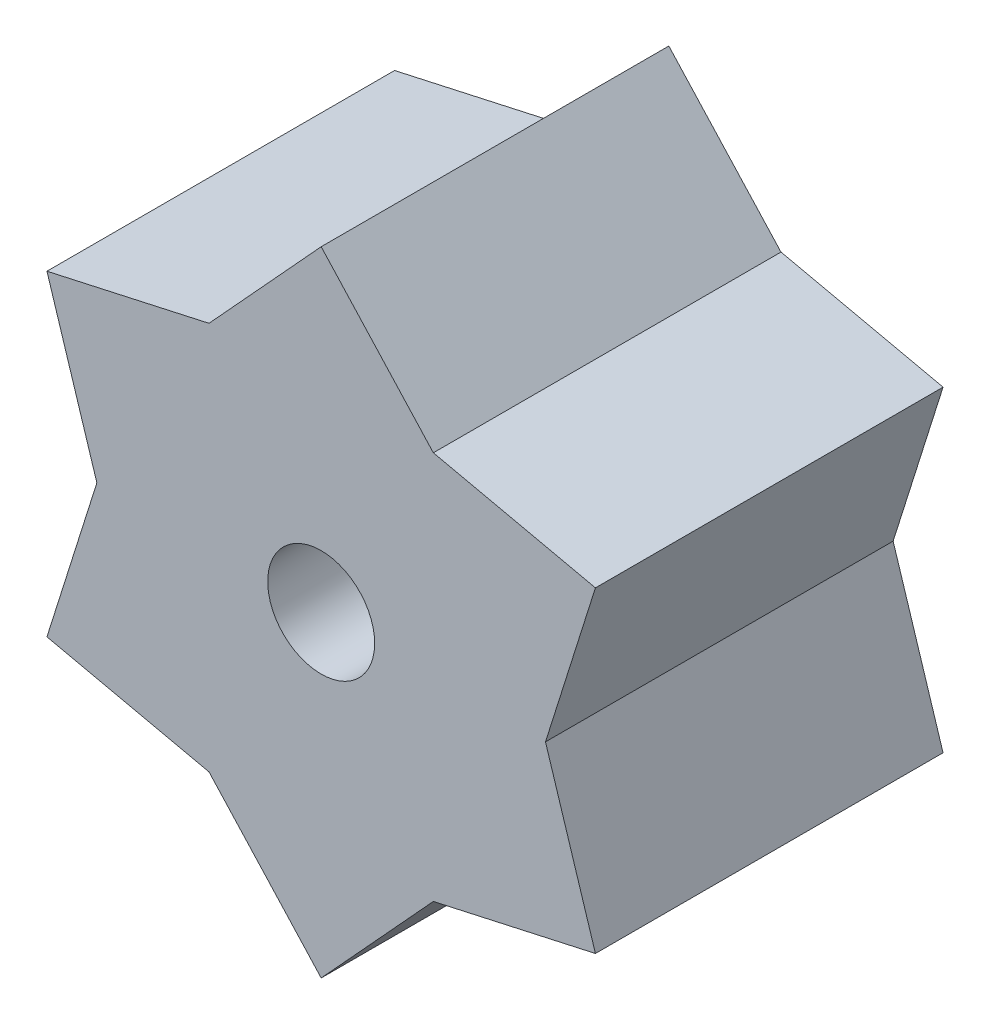
ISO-10303-21;
HEADER;
FILE_DESCRIPTION(('STEP AP214'),'2;1');
FILE_NAME('part.step','',(''),(''),'','','');
FILE_SCHEMA(('AUTOMOTIVE_DESIGN { 1 0 10303 214 1 1 1 1 }'));
ENDSEC;
DATA;
#1=APPLICATION_CONTEXT('core data for automotive mechanical design processes');
#2=APPLICATION_PROTOCOL_DEFINITION('international standard','automotive_design',2000,#1);
#3=PRODUCT_CONTEXT('',#1,'mechanical');
#4=PRODUCT('Part','Part','',(#3));
#5=PRODUCT_RELATED_PRODUCT_CATEGORY('part','',(#4));
#6=PRODUCT_DEFINITION_FORMATION('','',#4);
#7=PRODUCT_DEFINITION_CONTEXT('part definition',#1,'design');
#8=PRODUCT_DEFINITION('design','',#6,#7);
#9=PRODUCT_DEFINITION_SHAPE('','',#8);
#10=(LENGTH_UNIT() NAMED_UNIT(*) SI_UNIT(.MILLI.,.METRE.));
#11=(NAMED_UNIT(*) PLANE_ANGLE_UNIT() SI_UNIT($,.RADIAN.));
#12=(NAMED_UNIT(*) SI_UNIT($,.STERADIAN.) SOLID_ANGLE_UNIT());
#13=UNCERTAINTY_MEASURE_WITH_UNIT(LENGTH_MEASURE(1.E-05),#10,'distance_accuracy_value','');
#14=(GEOMETRIC_REPRESENTATION_CONTEXT(3) GLOBAL_UNCERTAINTY_ASSIGNED_CONTEXT((#13)) GLOBAL_UNIT_ASSIGNED_CONTEXT((#10,
#11,#12)) REPRESENTATION_CONTEXT('',''));
#15=CARTESIAN_POINT('',(0.,0.,0.));
#16=DIRECTION('',(0.,0.,1.));
#17=DIRECTION('',(1.,0.,0.));
#18=AXIS2_PLACEMENT_3D('',#15,#16,#17);
#19=CARTESIAN_POINT('',(3.8148678029929,1.20282319801711,-6.5));
#20=DIRECTION('',(-0.953716950748225,-0.300705799504279,0.));
#21=DIRECTION('',(0.300705799504279,-0.953716950748225,0.));
#22=AXIS2_PLACEMENT_3D('',#19,#20,#21);
#23=PLANE('',#22);
#24=DIRECTION('',(0.300705799504279,-0.953716950748225,0.));
#25=VECTOR('',#24,1.);
#26=CARTESIAN_POINT('',(3.8148678029929,1.20282319801711,0.));
#27=LINE('',#26,#25);
#28=CARTESIAN_POINT('',(4.19411650056326,0.,0.));
#29=VERTEX_POINT('',#28);
#30=CARTESIAN_POINT('',(5.12751898427232,-2.96037446584454,0.));
#31=VERTEX_POINT('',#30);
#32=EDGE_CURVE('E177',#29,#31,#27,.T.);
#33=ORIENTED_EDGE('',*,*,#32,.T.);
#34=DIRECTION('',(0.,0.,1.));
#35=VECTOR('',#34,1.);
#36=CARTESIAN_POINT('',(5.12751898427232,-2.96037446584454,-6.5));
#37=LINE('',#36,#35);
#38=CARTESIAN_POINT('',(5.12751898427232,-2.96037446584454,-6.5));
#39=VERTEX_POINT('',#38);
#40=EDGE_CURVE('E11',#39,#31,#37,.T.);
#41=ORIENTED_EDGE('',*,*,#40,.F.);
#42=DIRECTION('',(0.300705799504279,-0.953716950748225,0.));
#43=VECTOR('',#42,1.);
#44=CARTESIAN_POINT('',(3.8148678029929,1.20282319801711,-6.5));
#45=LINE('',#44,#43);
#46=CARTESIAN_POINT('',(4.19411650056326,0.,-6.5));
#47=VERTEX_POINT('',#46);
#48=EDGE_CURVE('E215',#47,#39,#45,.T.);
#49=ORIENTED_EDGE('',*,*,#48,.F.);
#50=DIRECTION('',(0.,0.,1.));
#51=VECTOR('',#50,1.);
#52=CARTESIAN_POINT('',(4.19411650056326,0.,-6.5));
#53=LINE('',#52,#51);
#54=EDGE_CURVE('E50',#47,#29,#53,.T.);
#55=ORIENTED_EDGE('',*,*,#54,.T.);
#56=EDGE_LOOP('',(#33,#41,#49,#55));
#57=FACE_BOUND('',#56,.T.);
#58=ADVANCED_FACE('F47',(#57),#23,.F.);
#59=CARTESIAN_POINT('',(0.865758455752425,-3.90518402847976,-6.5));
#60=DIRECTION('',(-0.216439613938105,0.976296007119933,0.));
#61=DIRECTION('',(-0.976296007119933,-0.216439613938105,0.));
#62=AXIS2_PLACEMENT_3D('',#59,#60,#61);
#63=PLANE('',#62);
#64=DIRECTION('',(-0.976296007119933,-0.216439613938105,0.));
#65=VECTOR('',#64,1.);
#66=CARTESIAN_POINT('',(0.865758455752425,-3.90518402847976,0.));
#67=LINE('',#66,#65);
#68=CARTESIAN_POINT('',(2.0970582502816,-3.63221143591929,0.));
#69=VERTEX_POINT('',#68);
#70=EDGE_CURVE('E103',#31,#69,#67,.T.);
#71=ORIENTED_EDGE('',*,*,#70,.T.);
#72=DIRECTION('',(0.,0.,1.));
#73=VECTOR('',#72,1.);
#74=CARTESIAN_POINT('',(2.0970582502816,-3.63221143591929,-6.5));
#75=LINE('',#74,#73);
#76=CARTESIAN_POINT('',(2.0970582502816,-3.63221143591929,-6.5));
#77=VERTEX_POINT('',#76);
#78=EDGE_CURVE('E57',#77,#69,#75,.T.);
#79=ORIENTED_EDGE('',*,*,#78,.F.);
#80=DIRECTION('',(-0.976296007119933,-0.216439613938105,0.));
#81=VECTOR('',#80,1.);
#82=CARTESIAN_POINT('',(0.865758455752425,-3.90518402847976,-6.5));
#83=LINE('',#82,#81);
#84=EDGE_CURVE('E65',#39,#77,#83,.T.);
#85=ORIENTED_EDGE('',*,*,#84,.F.);
#86=ORIENTED_EDGE('',*,*,#40,.T.);
#87=EDGE_LOOP('',(#71,#79,#85,#86));
#88=FACE_BOUND('',#87,.T.);
#89=ADVANCED_FACE('F273',(#88),#63,.F.);
#90=CARTESIAN_POINT('',(2.94910934724051,-2.70236083046262,-6.5));
#91=DIRECTION('',(-0.737277336810128,0.675590207615656,0.));
#92=DIRECTION('',(-0.675590207615656,-0.737277336810128,0.));
#93=AXIS2_PLACEMENT_3D('',#90,#91,#92);
#94=PLANE('',#93);
#95=DIRECTION('',(-0.675590207615656,-0.737277336810128,0.));
#96=VECTOR('',#95,1.);
#97=CARTESIAN_POINT('',(2.94910934724051,-2.70236083046262,0.));
#98=LINE('',#97,#96);
#99=CARTESIAN_POINT('',(0.,-5.92074893168908,0.));
#100=VERTEX_POINT('',#99);
#101=EDGE_CURVE('E154',#69,#100,#98,.T.);
#102=ORIENTED_EDGE('',*,*,#101,.T.);
#103=DIRECTION('',(0.,0.,1.));
#104=VECTOR('',#103,1.);
#105=CARTESIAN_POINT('',(0.,-5.92074893168908,-6.5));
#106=LINE('',#105,#104);
#107=CARTESIAN_POINT('',(0.,-5.92074893168908,-6.5));
#108=VERTEX_POINT('',#107);
#109=EDGE_CURVE('E152',#108,#100,#106,.T.);
#110=ORIENTED_EDGE('',*,*,#109,.F.);
#111=DIRECTION('',(-0.675590207615656,-0.737277336810128,0.));
#112=VECTOR('',#111,1.);
#113=CARTESIAN_POINT('',(2.94910934724051,-2.70236083046262,-6.5));
#114=LINE('',#113,#112);
#115=EDGE_CURVE('E141',#77,#108,#114,.T.);
#116=ORIENTED_EDGE('',*,*,#115,.F.);
#117=ORIENTED_EDGE('',*,*,#78,.T.);
#118=EDGE_LOOP('',(#102,#110,#116,#117));
#119=FACE_BOUND('',#118,.T.);
#120=ADVANCED_FACE('F153',(#119),#94,.F.);
#121=CARTESIAN_POINT('',(-2.94910934724051,-2.70236083046267,-6.5));
#122=DIRECTION('',(0.737277336810123,0.675590207615661,0.));
#123=DIRECTION('',(-0.675590207615661,0.737277336810123,0.));
#124=AXIS2_PLACEMENT_3D('',#121,#122,#123);
#125=PLANE('',#124);
#126=DIRECTION('',(-0.675590207615661,0.737277336810123,0.));
#127=VECTOR('',#126,1.);
#128=CARTESIAN_POINT('',(-2.94910934724051,-2.70236083046267,0.));
#129=LINE('',#128,#127);
#130=CARTESIAN_POINT('',(-2.09705825028166,-3.63221143591926,0.));
#131=VERTEX_POINT('',#130);
#132=EDGE_CURVE('E205',#100,#131,#129,.T.);
#133=ORIENTED_EDGE('',*,*,#132,.T.);
#134=DIRECTION('',(0.,0.,1.));
#135=VECTOR('',#134,1.);
#136=CARTESIAN_POINT('',(-2.09705825028166,-3.63221143591926,-6.5));
#137=LINE('',#136,#135);
#138=CARTESIAN_POINT('',(-2.09705825028166,-3.63221143591926,-6.5));
#139=VERTEX_POINT('',#138);
#140=EDGE_CURVE('E158',#139,#131,#137,.T.);
#141=ORIENTED_EDGE('',*,*,#140,.F.);
#142=DIRECTION('',(-0.675590207615661,0.737277336810123,0.));
#143=VECTOR('',#142,1.);
#144=CARTESIAN_POINT('',(-2.94910934724051,-2.70236083046267,-6.5));
#145=LINE('',#144,#143);
#146=EDGE_CURVE('E146',#108,#139,#145,.T.);
#147=ORIENTED_EDGE('',*,*,#146,.F.);
#148=ORIENTED_EDGE('',*,*,#109,.T.);
#149=EDGE_LOOP('',(#133,#141,#147,#148));
#150=FACE_BOUND('',#149,.T.);
#151=ADVANCED_FACE('F160',(#150),#125,.F.);
#152=CARTESIAN_POINT('',(-0.865758455752388,-3.90518402847974,-6.5));
#153=DIRECTION('',(0.216439613938097,0.976296007119935,0.));
#154=DIRECTION('',(-0.976296007119935,0.216439613938097,0.));
#155=AXIS2_PLACEMENT_3D('',#152,#153,#154);
#156=PLANE('',#155);
#157=DIRECTION('',(-0.976296007119935,0.216439613938097,0.));
#158=VECTOR('',#157,1.);
#159=CARTESIAN_POINT('',(-0.865758455752388,-3.90518402847974,0.));
#160=LINE('',#159,#158);
#161=CARTESIAN_POINT('',(-5.12751898427232,-2.96037446584454,0.));
#162=VERTEX_POINT('',#161);
#163=EDGE_CURVE('E202',#131,#162,#160,.T.);
#164=ORIENTED_EDGE('',*,*,#163,.T.);
#165=DIRECTION('',(0.,0.,1.));
#166=VECTOR('',#165,1.);
#167=CARTESIAN_POINT('',(-5.12751898427232,-2.96037446584454,-6.5));
#168=LINE('',#167,#166);
#169=CARTESIAN_POINT('',(-5.12751898427232,-2.96037446584454,-6.5));
#170=VERTEX_POINT('',#169);
#171=EDGE_CURVE('E221',#170,#162,#168,.T.);
#172=ORIENTED_EDGE('',*,*,#171,.F.);
#173=DIRECTION('',(-0.976296007119935,0.216439613938097,0.));
#174=VECTOR('',#173,1.);
#175=CARTESIAN_POINT('',(-0.865758455752388,-3.90518402847974,-6.5));
#176=LINE('',#175,#174);
#177=EDGE_CURVE('E164',#139,#170,#176,.T.);
#178=ORIENTED_EDGE('',*,*,#177,.F.);
#179=ORIENTED_EDGE('',*,*,#140,.T.);
#180=EDGE_LOOP('',(#164,#172,#178,#179));
#181=FACE_BOUND('',#180,.T.);
#182=ADVANCED_FACE('F286',(#181),#156,.F.);
#183=CARTESIAN_POINT('',(-3.81486780299294,1.20282319801709,-6.5));
#184=DIRECTION('',(0.953716950748227,-0.300705799504271,0.));
#185=DIRECTION('',(0.300705799504271,0.953716950748228,0.));
#186=AXIS2_PLACEMENT_3D('',#183,#184,#185);
#187=PLANE('',#186);
#188=DIRECTION('',(0.300705799504271,0.953716950748228,0.));
#189=VECTOR('',#188,1.);
#190=CARTESIAN_POINT('',(-3.81486780299294,1.20282319801709,0.));
#191=LINE('',#190,#189);
#192=CARTESIAN_POINT('',(-4.19411650056326,0.,0.));
#193=VERTEX_POINT('',#192);
#194=EDGE_CURVE('E199',#162,#193,#191,.T.);
#195=ORIENTED_EDGE('',*,*,#194,.T.);
#196=DIRECTION('',(0.,0.,1.));
#197=VECTOR('',#196,1.);
#198=CARTESIAN_POINT('',(-4.19411650056326,0.,-6.5));
#199=LINE('',#198,#197);
#200=CARTESIAN_POINT('',(-4.19411650056326,0.,-6.5));
#201=VERTEX_POINT('',#200);
#202=EDGE_CURVE('E225',#201,#193,#199,.T.);
#203=ORIENTED_EDGE('',*,*,#202,.F.);
#204=DIRECTION('',(0.300705799504271,0.953716950748228,0.));
#205=VECTOR('',#204,1.);
#206=CARTESIAN_POINT('',(-3.81486780299294,1.20282319801709,-6.5));
#207=LINE('',#206,#205);
#208=EDGE_CURVE('E167',#170,#201,#207,.T.);
#209=ORIENTED_EDGE('',*,*,#208,.F.);
#210=ORIENTED_EDGE('',*,*,#171,.T.);
#211=EDGE_LOOP('',(#195,#203,#209,#210));
#212=FACE_BOUND('',#211,.T.);
#213=ADVANCED_FACE('F289',(#212),#187,.F.);
#214=CARTESIAN_POINT('',(-3.8148678029929,-1.20282319801712,-6.5));
#215=DIRECTION('',(0.953716950748225,0.300705799504279,0.));
#216=DIRECTION('',(-0.300705799504279,0.953716950748225,0.));
#217=AXIS2_PLACEMENT_3D('',#214,#215,#216);
#218=PLANE('',#217);
#219=DIRECTION('',(-0.300705799504279,0.953716950748225,0.));
#220=VECTOR('',#219,1.);
#221=CARTESIAN_POINT('',(-3.8148678029929,-1.20282319801712,0.));
#222=LINE('',#221,#220);
#223=CARTESIAN_POINT('',(-5.12751898427232,2.96037446584454,0.));
#224=VERTEX_POINT('',#223);
#225=EDGE_CURVE('E196',#193,#224,#222,.T.);
#226=ORIENTED_EDGE('',*,*,#225,.T.);
#227=DIRECTION('',(0.,0.,1.));
#228=VECTOR('',#227,1.);
#229=CARTESIAN_POINT('',(-5.12751898427232,2.96037446584454,-6.5));
#230=LINE('',#229,#228);
#231=CARTESIAN_POINT('',(-5.12751898427232,2.96037446584454,-6.5));
#232=VERTEX_POINT('',#231);
#233=EDGE_CURVE('E229',#232,#224,#230,.T.);
#234=ORIENTED_EDGE('',*,*,#233,.F.);
#235=DIRECTION('',(-0.300705799504279,0.953716950748225,0.));
#236=VECTOR('',#235,1.);
#237=CARTESIAN_POINT('',(-3.8148678029929,-1.20282319801712,-6.5));
#238=LINE('',#237,#236);
#239=EDGE_CURVE('E331',#201,#232,#238,.T.);
#240=ORIENTED_EDGE('',*,*,#239,.F.);
#241=ORIENTED_EDGE('',*,*,#202,.T.);
#242=EDGE_LOOP('',(#226,#234,#240,#241));
#243=FACE_BOUND('',#242,.T.);
#244=ADVANCED_FACE('F293',(#243),#218,.F.);
#245=CARTESIAN_POINT('',(-0.865758455752427,3.90518402847976,-6.5));
#246=DIRECTION('',(0.216439613938105,-0.976296007119933,0.));
#247=DIRECTION('',(0.976296007119933,0.216439613938105,0.));
#248=AXIS2_PLACEMENT_3D('',#245,#246,#247);
#249=PLANE('',#248);
#250=DIRECTION('',(0.976296007119933,0.216439613938105,0.));
#251=VECTOR('',#250,1.);
#252=CARTESIAN_POINT('',(-0.865758455752427,3.90518402847976,0.));
#253=LINE('',#252,#251);
#254=CARTESIAN_POINT('',(-2.0970582502816,3.63221143591929,0.));
#255=VERTEX_POINT('',#254);
#256=EDGE_CURVE('E193',#224,#255,#253,.T.);
#257=ORIENTED_EDGE('',*,*,#256,.T.);
#258=DIRECTION('',(0.,0.,1.));
#259=VECTOR('',#258,1.);
#260=CARTESIAN_POINT('',(-2.0970582502816,3.63221143591929,-6.5));
#261=LINE('',#260,#259);
#262=CARTESIAN_POINT('',(-2.0970582502816,3.63221143591929,-6.5));
#263=VERTEX_POINT('',#262);
#264=EDGE_CURVE('E233',#263,#255,#261,.T.);
#265=ORIENTED_EDGE('',*,*,#264,.F.);
#266=DIRECTION('',(0.976296007119933,0.216439613938105,0.));
#267=VECTOR('',#266,1.);
#268=CARTESIAN_POINT('',(-0.865758455752427,3.90518402847976,-6.5));
#269=LINE('',#268,#267);
#270=EDGE_CURVE('E328',#232,#263,#269,.T.);
#271=ORIENTED_EDGE('',*,*,#270,.F.);
#272=ORIENTED_EDGE('',*,*,#233,.T.);
#273=EDGE_LOOP('',(#257,#265,#271,#272));
#274=FACE_BOUND('',#273,.T.);
#275=ADVANCED_FACE('F297',(#274),#249,.F.);
#276=CARTESIAN_POINT('',(-2.94910934724051,2.70236083046262,-6.5));
#277=DIRECTION('',(0.737277336810128,-0.675590207615656,0.));
#278=DIRECTION('',(0.675590207615656,0.737277336810128,0.));
#279=AXIS2_PLACEMENT_3D('',#276,#277,#278);
#280=PLANE('',#279);
#281=DIRECTION('',(0.675590207615656,0.737277336810128,0.));
#282=VECTOR('',#281,1.);
#283=CARTESIAN_POINT('',(-2.94910934724051,2.70236083046262,0.));
#284=LINE('',#283,#282);
#285=CARTESIAN_POINT('',(0.,5.92074893168908,0.));
#286=VERTEX_POINT('',#285);
#287=EDGE_CURVE('E190',#255,#286,#284,.T.);
#288=ORIENTED_EDGE('',*,*,#287,.T.);
#289=DIRECTION('',(0.,0.,1.));
#290=VECTOR('',#289,1.);
#291=CARTESIAN_POINT('',(0.,5.92074893168908,-6.5));
#292=LINE('',#291,#290);
#293=CARTESIAN_POINT('',(0.,5.92074893168908,-6.5));
#294=VERTEX_POINT('',#293);
#295=EDGE_CURVE('E237',#294,#286,#292,.T.);
#296=ORIENTED_EDGE('',*,*,#295,.F.);
#297=DIRECTION('',(0.675590207615656,0.737277336810128,0.));
#298=VECTOR('',#297,1.);
#299=CARTESIAN_POINT('',(-2.94910934724051,2.70236083046262,-6.5));
#300=LINE('',#299,#298);
#301=EDGE_CURVE('E321',#263,#294,#300,.T.);
#302=ORIENTED_EDGE('',*,*,#301,.F.);
#303=ORIENTED_EDGE('',*,*,#264,.T.);
#304=EDGE_LOOP('',(#288,#296,#302,#303));
#305=FACE_BOUND('',#304,.T.);
#306=ADVANCED_FACE('F301',(#305),#280,.F.);
#307=CARTESIAN_POINT('',(2.94910934724052,2.70236083046267,-6.5));
#308=DIRECTION('',(-0.737277336810123,-0.675590207615661,0.));
#309=DIRECTION('',(0.675590207615661,-0.737277336810123,0.));
#310=AXIS2_PLACEMENT_3D('',#307,#308,#309);
#311=PLANE('',#310);
#312=DIRECTION('',(0.675590207615661,-0.737277336810123,0.));
#313=VECTOR('',#312,1.);
#314=CARTESIAN_POINT('',(2.94910934724052,2.70236083046267,0.));
#315=LINE('',#314,#313);
#316=CARTESIAN_POINT('',(2.09705825028166,3.63221143591926,0.));
#317=VERTEX_POINT('',#316);
#318=EDGE_CURVE('E187',#286,#317,#315,.T.);
#319=ORIENTED_EDGE('',*,*,#318,.T.);
#320=DIRECTION('',(0.,0.,1.));
#321=VECTOR('',#320,1.);
#322=CARTESIAN_POINT('',(2.09705825028166,3.63221143591926,-6.5));
#323=LINE('',#322,#321);
#324=CARTESIAN_POINT('',(2.09705825028166,3.63221143591926,-6.5));
#325=VERTEX_POINT('',#324);
#326=EDGE_CURVE('E241',#325,#317,#323,.T.);
#327=ORIENTED_EDGE('',*,*,#326,.F.);
#328=DIRECTION('',(0.675590207615661,-0.737277336810123,0.));
#329=VECTOR('',#328,1.);
#330=CARTESIAN_POINT('',(2.94910934724052,2.70236083046267,-6.5));
#331=LINE('',#330,#329);
#332=EDGE_CURVE('E317',#294,#325,#331,.T.);
#333=ORIENTED_EDGE('',*,*,#332,.F.);
#334=ORIENTED_EDGE('',*,*,#295,.T.);
#335=EDGE_LOOP('',(#319,#327,#333,#334));
#336=FACE_BOUND('',#335,.T.);
#337=ADVANCED_FACE('F269',(#336),#311,.F.);
#338=CARTESIAN_POINT('',(0.86575845575239,3.90518402847974,-6.5));
#339=DIRECTION('',(-0.216439613938097,-0.976296007119934,0.));
#340=DIRECTION('',(0.976296007119935,-0.216439613938097,0.));
#341=AXIS2_PLACEMENT_3D('',#338,#339,#340);
#342=PLANE('',#341);
#343=DIRECTION('',(0.976296007119935,-0.216439613938097,0.));
#344=VECTOR('',#343,1.);
#345=CARTESIAN_POINT('',(0.86575845575239,3.90518402847974,0.));
#346=LINE('',#345,#344);
#347=CARTESIAN_POINT('',(5.12751898427232,2.96037446584454,0.));
#348=VERTEX_POINT('',#347);
#349=EDGE_CURVE('E184',#317,#348,#346,.T.);
#350=ORIENTED_EDGE('',*,*,#349,.T.);
#351=DIRECTION('',(0.,0.,1.));
#352=VECTOR('',#351,1.);
#353=CARTESIAN_POINT('',(5.12751898427232,2.96037446584454,-6.5));
#354=LINE('',#353,#352);
#355=CARTESIAN_POINT('',(5.12751898427232,2.96037446584454,-6.5));
#356=VERTEX_POINT('',#355);
#357=EDGE_CURVE('E244',#356,#348,#354,.T.);
#358=ORIENTED_EDGE('',*,*,#357,.F.);
#359=DIRECTION('',(0.976296007119935,-0.216439613938097,0.));
#360=VECTOR('',#359,1.);
#361=CARTESIAN_POINT('',(0.86575845575239,3.90518402847974,-6.5));
#362=LINE('',#361,#360);
#363=EDGE_CURVE('E315',#325,#356,#362,.T.);
#364=ORIENTED_EDGE('',*,*,#363,.F.);
#365=ORIENTED_EDGE('',*,*,#326,.T.);
#366=EDGE_LOOP('',(#350,#358,#364,#365));
#367=FACE_BOUND('',#366,.T.);
#368=ADVANCED_FACE('F262',(#367),#342,.F.);
#369=CARTESIAN_POINT('',(3.81486780299294,-1.2028231980171,-6.5));
#370=DIRECTION('',(-0.953716950748227,0.300705799504272,0.));
#371=DIRECTION('',(-0.300705799504272,-0.953716950748227,0.));
#372=AXIS2_PLACEMENT_3D('',#369,#370,#371);
#373=PLANE('',#372);
#374=DIRECTION('',(-0.300705799504272,-0.953716950748228,0.));
#375=VECTOR('',#374,1.);
#376=CARTESIAN_POINT('',(3.81486780299294,-1.2028231980171,0.));
#377=LINE('',#376,#375);
#378=EDGE_CURVE('E181',#348,#29,#377,.T.);
#379=ORIENTED_EDGE('',*,*,#378,.T.);
#380=ORIENTED_EDGE('',*,*,#54,.F.);
#381=DIRECTION('',(-0.300705799504272,-0.953716950748228,0.));
#382=VECTOR('',#381,1.);
#383=CARTESIAN_POINT('',(3.81486780299294,-1.2028231980171,-6.5));
#384=LINE('',#383,#382);
#385=EDGE_CURVE('E115',#356,#47,#384,.T.);
#386=ORIENTED_EDGE('',*,*,#385,.F.);
#387=ORIENTED_EDGE('',*,*,#357,.T.);
#388=EDGE_LOOP('',(#379,#380,#386,#387));
#389=FACE_BOUND('',#388,.T.);
#390=ADVANCED_FACE('F259',(#389),#373,.F.);
#391=CARTESIAN_POINT('',(0.,0.,-6.5));
#392=DIRECTION('',(0.,0.,1.));
#393=DIRECTION('',(1.,0.,0.));
#394=AXIS2_PLACEMENT_3D('',#391,#392,#393);
#395=CYLINDRICAL_SURFACE('',#394,1.);
#396=CARTESIAN_POINT('',(0.,0.,-6.5));
#397=DIRECTION('',(0.,0.,1.));
#398=DIRECTION('',(1.,0.,0.));
#399=AXIS2_PLACEMENT_3D('',#396,#397,#398);
#400=CIRCLE('',#399,1.);
#401=CARTESIAN_POINT('',(1.,0.,-6.5));
#402=VERTEX_POINT('',#401);
#403=EDGE_CURVE('E173',#402,#402,#400,.T.);
#404=CARTESIAN_POINT('',(0.,0.,0.));
#405=DIRECTION('',(0.,0.,1.));
#406=DIRECTION('',(1.,0.,0.));
#407=AXIS2_PLACEMENT_3D('',#404,#405,#406);
#408=CIRCLE('',#407,1.);
#409=CARTESIAN_POINT('',(1.,0.,0.));
#410=VERTEX_POINT('',#409);
#411=EDGE_CURVE('E212',#410,#410,#408,.T.);
#412=CARTESIAN_POINT('',(1.,0.,-6.5));
#413=CARTESIAN_POINT('',(1.,0.,-6.43229166666667));
#414=CARTESIAN_POINT('',(1.,0.,-6.36458333333333));
#415=CARTESIAN_POINT('',(1.,0.,-6.22916666666667));
#416=CARTESIAN_POINT('',(1.,0.,-6.16145833333333));
#417=CARTESIAN_POINT('',(1.,0.,-6.02604166666667));
#418=CARTESIAN_POINT('',(1.,0.,-5.95833333333333));
#419=CARTESIAN_POINT('',(1.,0.,-5.82291666666667));
#420=CARTESIAN_POINT('',(1.,0.,-5.75520833333333));
#421=CARTESIAN_POINT('',(1.,0.,-5.61979166666667));
#422=CARTESIAN_POINT('',(1.,0.,-5.55208333333333));
#423=CARTESIAN_POINT('',(1.,0.,-5.41666666666667));
#424=CARTESIAN_POINT('',(1.,0.,-5.34895833333333));
#425=CARTESIAN_POINT('',(1.,0.,-5.21354166666667));
#426=CARTESIAN_POINT('',(1.,0.,-5.14583333333333));
#427=CARTESIAN_POINT('',(1.,0.,-5.01041666666667));
#428=CARTESIAN_POINT('',(1.,0.,-4.94270833333333));
#429=CARTESIAN_POINT('',(1.,0.,-4.80729166666667));
#430=CARTESIAN_POINT('',(1.,0.,-4.73958333333333));
#431=CARTESIAN_POINT('',(1.,0.,-4.60416666666667));
#432=CARTESIAN_POINT('',(1.,0.,-4.53645833333333));
#433=CARTESIAN_POINT('',(1.,0.,-4.40104166666667));
#434=CARTESIAN_POINT('',(1.,0.,-4.33333333333333));
#435=CARTESIAN_POINT('',(1.,0.,-4.19791666666667));
#436=CARTESIAN_POINT('',(1.,0.,-4.13020833333333));
#437=CARTESIAN_POINT('',(1.,0.,-3.99479166666667));
#438=CARTESIAN_POINT('',(1.,0.,-3.92708333333333));
#439=CARTESIAN_POINT('',(1.,0.,-3.79166666666667));
#440=CARTESIAN_POINT('',(1.,0.,-3.72395833333333));
#441=CARTESIAN_POINT('',(1.,0.,-3.58854166666667));
#442=CARTESIAN_POINT('',(1.,0.,-3.52083333333333));
#443=CARTESIAN_POINT('',(1.,0.,-3.38541666666667));
#444=CARTESIAN_POINT('',(1.,0.,-3.31770833333333));
#445=CARTESIAN_POINT('',(1.,0.,-3.18229166666667));
#446=CARTESIAN_POINT('',(1.,0.,-3.11458333333333));
#447=CARTESIAN_POINT('',(1.,0.,-2.97916666666667));
#448=CARTESIAN_POINT('',(1.,0.,-2.91145833333333));
#449=CARTESIAN_POINT('',(1.,0.,-2.77604166666667));
#450=CARTESIAN_POINT('',(1.,0.,-2.70833333333333));
#451=CARTESIAN_POINT('',(1.,0.,-2.57291666666667));
#452=CARTESIAN_POINT('',(1.,0.,-2.50520833333333));
#453=CARTESIAN_POINT('',(1.,0.,-2.36979166666667));
#454=CARTESIAN_POINT('',(1.,0.,-2.30208333333333));
#455=CARTESIAN_POINT('',(1.,0.,-2.16666666666667));
#456=CARTESIAN_POINT('',(1.,0.,-2.09895833333333));
#457=CARTESIAN_POINT('',(1.,0.,-1.96354166666667));
#458=CARTESIAN_POINT('',(1.,0.,-1.89583333333333));
#459=CARTESIAN_POINT('',(1.,0.,-1.76041666666667));
#460=CARTESIAN_POINT('',(1.,0.,-1.69270833333333));
#461=CARTESIAN_POINT('',(1.,0.,-1.55729166666667));
#462=CARTESIAN_POINT('',(1.,0.,-1.48958333333333));
#463=CARTESIAN_POINT('',(1.,0.,-1.35416666666667));
#464=CARTESIAN_POINT('',(1.,0.,-1.28645833333333));
#465=CARTESIAN_POINT('',(1.,0.,-1.15104166666667));
#466=CARTESIAN_POINT('',(1.,0.,-1.08333333333333));
#467=CARTESIAN_POINT('',(1.,0.,-0.947916666666667));
#468=CARTESIAN_POINT('',(1.,0.,-0.880208333333333));
#469=CARTESIAN_POINT('',(1.,0.,-0.744791666666667));
#470=CARTESIAN_POINT('',(1.,0.,-0.677083333333334));
#471=CARTESIAN_POINT('',(1.,0.,-0.541666666666667));
#472=CARTESIAN_POINT('',(1.,0.,-0.473958333333334));
#473=CARTESIAN_POINT('',(1.,0.,-0.338541666666667));
#474=CARTESIAN_POINT('',(1.,0.,-0.270833333333334));
#475=CARTESIAN_POINT('',(1.,0.,-0.135416666666667));
#476=CARTESIAN_POINT('',(1.,0.,-0.0677083333333333));
#477=CARTESIAN_POINT('',(1.,0.,0.));
#478=B_SPLINE_CURVE_WITH_KNOTS('',3,(#412,#413,#414,#415,#416,#417,#418,#419,#420,#421,#422,
#423,#424,#425,#426,#427,#428,#429,#430,#431,#432,#433,#434,#435,#436,#437,#438,#439,#440,#441,
#442,#443,#444,#445,#446,#447,#448,#449,#450,#451,#452,#453,#454,#455,#456,#457,#458,#459,#460,
#461,#462,#463,#464,#465,#466,#467,#468,#469,#470,#471,#472,#473,#474,#475,#476,#477),
.UNSPECIFIED.,.F.,.F.,(4,2,2,2,2,2,2,2,2,2,2,2,2,2,2,2,2,2,2,2,2,2,2,2,2,2,2,2,2,2,2,2,4),(0.,
0.203125,0.40625,0.609375000000001,0.812500000000001,1.015625,1.21875,1.421875,1.625,1.828125,
2.03125,2.234375,2.4375,2.640625,2.84375,3.046875,3.25,3.453125,3.65625,3.859375,4.0625,
4.265625,4.46875,4.671875,4.875,5.078125,5.28125,5.484375,5.6875,5.890625,6.09375,6.296875,6.5),.UNSPECIFIED.);
#479=EDGE_CURVE('BSEAM261',#402,#410,#478,.T.);
#480=ORIENTED_EDGE('',*,*,#403,.F.);
#481=ORIENTED_EDGE('',*,*,#411,.T.);
#482=ORIENTED_EDGE('',*,*,#479,.T.);
#483=ORIENTED_EDGE('',*,*,#479,.F.);
#484=EDGE_LOOP('',(#480,#482,#481,#483));
#485=FACE_BOUND('',#484,.T.);
#486=ADVANCED_FACE('F261',(#485),#395,.F.);
#487=CARTESIAN_POINT('',(0.,0.,-6.5));
#488=DIRECTION('',(0.,0.,1.));
#489=DIRECTION('',(1.,0.,0.));
#490=AXIS2_PLACEMENT_3D('',#487,#488,#489);
#491=PLANE('',#490);
#492=ORIENTED_EDGE('',*,*,#48,.T.);
#493=ORIENTED_EDGE('',*,*,#84,.T.);
#494=ORIENTED_EDGE('',*,*,#115,.T.);
#495=ORIENTED_EDGE('',*,*,#146,.T.);
#496=ORIENTED_EDGE('',*,*,#177,.T.);
#497=ORIENTED_EDGE('',*,*,#208,.T.);
#498=ORIENTED_EDGE('',*,*,#239,.T.);
#499=ORIENTED_EDGE('',*,*,#270,.T.);
#500=ORIENTED_EDGE('',*,*,#301,.T.);
#501=ORIENTED_EDGE('',*,*,#332,.T.);
#502=ORIENTED_EDGE('',*,*,#363,.T.);
#503=ORIENTED_EDGE('',*,*,#385,.T.);
#504=EDGE_LOOP('',(#492,#493,#494,#495,#496,#497,#498,#499,#500,#501,#502,#503));
#505=FACE_BOUND('',#504,.T.);
#506=ORIENTED_EDGE('',*,*,#403,.T.);
#507=EDGE_LOOP('',(#506));
#508=FACE_BOUND('',#507,.T.);
#509=ADVANCED_FACE('F143',(#505,#508),#491,.F.);
#510=CARTESIAN_POINT('',(0.,0.,0.));
#511=DIRECTION('',(0.,0.,1.));
#512=DIRECTION('',(1.,0.,0.));
#513=AXIS2_PLACEMENT_3D('',#510,#511,#512);
#514=PLANE('',#513);
#515=ORIENTED_EDGE('',*,*,#32,.F.);
#516=ORIENTED_EDGE('',*,*,#378,.F.);
#517=ORIENTED_EDGE('',*,*,#349,.F.);
#518=ORIENTED_EDGE('',*,*,#318,.F.);
#519=ORIENTED_EDGE('',*,*,#287,.F.);
#520=ORIENTED_EDGE('',*,*,#256,.F.);
#521=ORIENTED_EDGE('',*,*,#225,.F.);
#522=ORIENTED_EDGE('',*,*,#194,.F.);
#523=ORIENTED_EDGE('',*,*,#163,.F.);
#524=ORIENTED_EDGE('',*,*,#132,.F.);
#525=ORIENTED_EDGE('',*,*,#101,.F.);
#526=ORIENTED_EDGE('',*,*,#70,.F.);
#527=EDGE_LOOP('',(#515,#516,#517,#518,#519,#520,#521,#522,#523,#524,#525,#526));
#528=FACE_BOUND('',#527,.T.);
#529=ORIENTED_EDGE('',*,*,#411,.F.);
#530=EDGE_LOOP('',(#529));
#531=FACE_BOUND('',#530,.T.);
#532=ADVANCED_FACE('F255',(#528,#531),#514,.T.);
#533=CLOSED_SHELL('',(#58,#89,#120,#151,#182,#213,#244,#275,#306,#337,#368,#390,#486,#509,#532));
#534=MANIFOLD_SOLID_BREP('B2',#533);
#535=ADVANCED_BREP_SHAPE_REPRESENTATION('',(#18,#534),#14);
#536=SHAPE_DEFINITION_REPRESENTATION(#9,#535);
ENDSEC;
END-ISO-10303-21;
